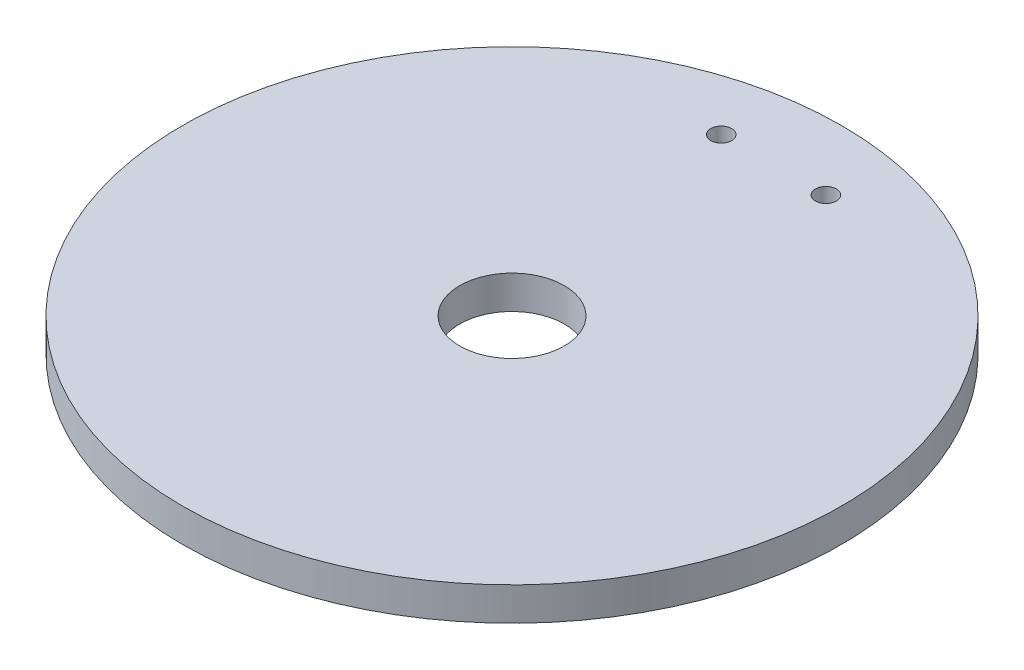
ISO-10303-21;
HEADER;
FILE_DESCRIPTION(('STEP AP214'),'2;1');
FILE_NAME('part.step','',(''),(''),'','','');
FILE_SCHEMA(('AUTOMOTIVE_DESIGN { 1 0 10303 214 1 1 1 1 }'));
ENDSEC;
DATA;
#1=APPLICATION_CONTEXT('core data for automotive mechanical design processes');
#2=APPLICATION_PROTOCOL_DEFINITION('international standard','automotive_design',2000,#1);
#3=PRODUCT_CONTEXT('',#1,'mechanical');
#4=PRODUCT('Part','Part','',(#3));
#5=PRODUCT_RELATED_PRODUCT_CATEGORY('part','',(#4));
#6=PRODUCT_DEFINITION_FORMATION('','',#4);
#7=PRODUCT_DEFINITION_CONTEXT('part definition',#1,'design');
#8=PRODUCT_DEFINITION('design','',#6,#7);
#9=PRODUCT_DEFINITION_SHAPE('','',#8);
#10=(LENGTH_UNIT() NAMED_UNIT(*) SI_UNIT(.MILLI.,.METRE.));
#11=(NAMED_UNIT(*) PLANE_ANGLE_UNIT() SI_UNIT($,.RADIAN.));
#12=(NAMED_UNIT(*) SI_UNIT($,.STERADIAN.) SOLID_ANGLE_UNIT());
#13=UNCERTAINTY_MEASURE_WITH_UNIT(LENGTH_MEASURE(1.E-05),#10,'distance_accuracy_value','');
#14=(GEOMETRIC_REPRESENTATION_CONTEXT(3) GLOBAL_UNCERTAINTY_ASSIGNED_CONTEXT((#13)) GLOBAL_UNIT_ASSIGNED_CONTEXT((#10,
#11,#12)) REPRESENTATION_CONTEXT('',''));
#15=CARTESIAN_POINT('',(0.,0.,0.));
#16=DIRECTION('',(0.,0.,1.));
#17=DIRECTION('',(1.,0.,0.));
#18=AXIS2_PLACEMENT_3D('',#15,#16,#17);
#19=CARTESIAN_POINT('',(0.,3.18,0.));
#20=DIRECTION('',(0.,1.,0.));
#21=DIRECTION('',(0.,0.,1.));
#22=AXIS2_PLACEMENT_3D('',#19,#20,#21);
#23=PLANE('',#22);
#24=CARTESIAN_POINT('',(-5.,3.18,-25.));
#25=DIRECTION('',(0.,1.,0.));
#26=DIRECTION('',(0.,0.,1.));
#27=AXIS2_PLACEMENT_3D('',#24,#25,#26);
#28=CIRCLE('',#27,1.);
#29=CARTESIAN_POINT('',(-5.,3.18,-24.));
#30=VERTEX_POINT('',#29);
#31=EDGE_CURVE('E69',#30,#30,#28,.T.);
#32=ORIENTED_EDGE('',*,*,#31,.F.);
#33=EDGE_LOOP('',(#32));
#34=FACE_BOUND('',#33,.T.);
#35=CARTESIAN_POINT('',(5.,3.18,-25.));
#36=DIRECTION('',(0.,1.,0.));
#37=DIRECTION('',(0.,0.,1.));
#38=AXIS2_PLACEMENT_3D('',#35,#36,#37);
#39=CIRCLE('',#38,1.);
#40=CARTESIAN_POINT('',(5.,3.18,-24.));
#41=VERTEX_POINT('',#40);
#42=EDGE_CURVE('E61',#41,#41,#39,.T.);
#43=ORIENTED_EDGE('',*,*,#42,.F.);
#44=EDGE_LOOP('',(#43));
#45=FACE_BOUND('',#44,.T.);
#46=CARTESIAN_POINT('',(0.,3.18,0.));
#47=DIRECTION('',(0.,1.,0.));
#48=DIRECTION('',(0.,0.,1.));
#49=AXIS2_PLACEMENT_3D('',#46,#47,#48);
#50=CIRCLE('',#49,31.5);
#51=CARTESIAN_POINT('',(0.,3.18,-31.5));
#52=VERTEX_POINT('',#51);
#53=EDGE_CURVE('E10',#52,#52,#50,.T.);
#54=ORIENTED_EDGE('',*,*,#53,.T.);
#55=EDGE_LOOP('',(#54));
#56=FACE_BOUND('',#55,.T.);
#57=CARTESIAN_POINT('',(0.,3.18,0.));
#58=DIRECTION('',(0.,1.,0.));
#59=DIRECTION('',(0.,0.,1.));
#60=AXIS2_PLACEMENT_3D('',#57,#58,#59);
#61=CIRCLE('',#60,5.);
#62=CARTESIAN_POINT('',(0.,3.18,-5.));
#63=VERTEX_POINT('',#62);
#64=EDGE_CURVE('E51',#63,#63,#61,.T.);
#65=ORIENTED_EDGE('',*,*,#64,.F.);
#66=EDGE_LOOP('',(#65));
#67=FACE_BOUND('',#66,.T.);
#68=ADVANCED_FACE('F38',(#34,#45,#56,#67),#23,.T.);
#69=CARTESIAN_POINT('',(0.,0.,0.));
#70=DIRECTION('',(0.,1.,0.));
#71=DIRECTION('',(0.,0.,1.));
#72=AXIS2_PLACEMENT_3D('',#69,#70,#71);
#73=PLANE('',#72);
#74=CARTESIAN_POINT('',(-5.,0.,-25.));
#75=DIRECTION('',(0.,1.,0.));
#76=DIRECTION('',(0.,0.,1.));
#77=AXIS2_PLACEMENT_3D('',#74,#75,#76);
#78=CIRCLE('',#77,1.);
#79=CARTESIAN_POINT('',(-5.,0.,-24.));
#80=VERTEX_POINT('',#79);
#81=EDGE_CURVE('E57',#80,#80,#78,.T.);
#82=ORIENTED_EDGE('',*,*,#81,.T.);
#83=EDGE_LOOP('',(#82));
#84=FACE_BOUND('',#83,.T.);
#85=CARTESIAN_POINT('',(5.,0.,-25.));
#86=DIRECTION('',(0.,1.,0.));
#87=DIRECTION('',(0.,0.,1.));
#88=AXIS2_PLACEMENT_3D('',#85,#86,#87);
#89=CIRCLE('',#88,1.);
#90=CARTESIAN_POINT('',(5.,0.,-24.));
#91=VERTEX_POINT('',#90);
#92=EDGE_CURVE('E65',#91,#91,#89,.T.);
#93=ORIENTED_EDGE('',*,*,#92,.T.);
#94=EDGE_LOOP('',(#93));
#95=FACE_BOUND('',#94,.T.);
#96=CARTESIAN_POINT('',(0.,0.,0.));
#97=DIRECTION('',(0.,1.,0.));
#98=DIRECTION('',(0.,0.,1.));
#99=AXIS2_PLACEMENT_3D('',#96,#97,#98);
#100=CIRCLE('',#99,31.5);
#101=CARTESIAN_POINT('',(0.,0.,-31.5));
#102=VERTEX_POINT('',#101);
#103=EDGE_CURVE('E42',#102,#102,#100,.T.);
#104=ORIENTED_EDGE('',*,*,#103,.F.);
#105=EDGE_LOOP('',(#104));
#106=FACE_BOUND('',#105,.T.);
#107=CARTESIAN_POINT('',(0.,0.,0.));
#108=DIRECTION('',(0.,1.,0.));
#109=DIRECTION('',(0.,0.,1.));
#110=AXIS2_PLACEMENT_3D('',#107,#108,#109);
#111=CIRCLE('',#110,5.);
#112=CARTESIAN_POINT('',(0.,0.,-5.));
#113=VERTEX_POINT('',#112);
#114=EDGE_CURVE('E53',#113,#113,#111,.T.);
#115=ORIENTED_EDGE('',*,*,#114,.T.);
#116=EDGE_LOOP('',(#115));
#117=FACE_BOUND('',#116,.T.);
#118=ADVANCED_FACE('F77',(#84,#95,#106,#117),#73,.F.);
#119=CARTESIAN_POINT('',(0.,3.18,0.));
#120=DIRECTION('',(0.,-1.,0.));
#121=DIRECTION('',(0.,0.,-1.));
#122=AXIS2_PLACEMENT_3D('',#119,#120,#121);
#123=CYLINDRICAL_SURFACE('',#122,31.5);
#124=CARTESIAN_POINT('',(0.,3.18,-31.5));
#125=CARTESIAN_POINT('',(0.,3.146875,-31.5));
#126=CARTESIAN_POINT('',(0.,3.11375,-31.5));
#127=CARTESIAN_POINT('',(0.,3.0475,-31.5));
#128=CARTESIAN_POINT('',(0.,3.014375,-31.5));
#129=CARTESIAN_POINT('',(0.,2.948125,-31.5));
#130=CARTESIAN_POINT('',(0.,2.915,-31.5));
#131=CARTESIAN_POINT('',(0.,2.84875,-31.5));
#132=CARTESIAN_POINT('',(0.,2.815625,-31.5));
#133=CARTESIAN_POINT('',(0.,2.749375,-31.5));
#134=CARTESIAN_POINT('',(0.,2.71625,-31.5));
#135=CARTESIAN_POINT('',(0.,2.65,-31.5));
#136=CARTESIAN_POINT('',(0.,2.616875,-31.5));
#137=CARTESIAN_POINT('',(0.,2.550625,-31.5));
#138=CARTESIAN_POINT('',(0.,2.5175,-31.5));
#139=CARTESIAN_POINT('',(0.,2.45125,-31.5));
#140=CARTESIAN_POINT('',(0.,2.418125,-31.5));
#141=CARTESIAN_POINT('',(0.,2.351875,-31.5));
#142=CARTESIAN_POINT('',(0.,2.31875,-31.5));
#143=CARTESIAN_POINT('',(0.,2.2525,-31.5));
#144=CARTESIAN_POINT('',(0.,2.219375,-31.5));
#145=CARTESIAN_POINT('',(0.,2.153125,-31.5));
#146=CARTESIAN_POINT('',(0.,2.12,-31.5));
#147=CARTESIAN_POINT('',(0.,2.05375,-31.5));
#148=CARTESIAN_POINT('',(0.,2.020625,-31.5));
#149=CARTESIAN_POINT('',(0.,1.954375,-31.5));
#150=CARTESIAN_POINT('',(0.,1.92125,-31.5));
#151=CARTESIAN_POINT('',(0.,1.855,-31.5));
#152=CARTESIAN_POINT('',(0.,1.821875,-31.5));
#153=CARTESIAN_POINT('',(0.,1.755625,-31.5));
#154=CARTESIAN_POINT('',(0.,1.7225,-31.5));
#155=CARTESIAN_POINT('',(0.,1.65625,-31.5));
#156=CARTESIAN_POINT('',(0.,1.623125,-31.5));
#157=CARTESIAN_POINT('',(0.,1.556875,-31.5));
#158=CARTESIAN_POINT('',(0.,1.52375,-31.5));
#159=CARTESIAN_POINT('',(0.,1.4575,-31.5));
#160=CARTESIAN_POINT('',(0.,1.424375,-31.5));
#161=CARTESIAN_POINT('',(0.,1.358125,-31.5));
#162=CARTESIAN_POINT('',(0.,1.325,-31.5));
#163=CARTESIAN_POINT('',(0.,1.25875,-31.5));
#164=CARTESIAN_POINT('',(0.,1.225625,-31.5));
#165=CARTESIAN_POINT('',(0.,1.159375,-31.5));
#166=CARTESIAN_POINT('',(0.,1.12625,-31.5));
#167=CARTESIAN_POINT('',(0.,1.06,-31.5));
#168=CARTESIAN_POINT('',(0.,1.026875,-31.5));
#169=CARTESIAN_POINT('',(0.,0.960625,-31.5));
#170=CARTESIAN_POINT('',(0.,0.9275,-31.5));
#171=CARTESIAN_POINT('',(0.,0.86125,-31.5));
#172=CARTESIAN_POINT('',(0.,0.828125,-31.5));
#173=CARTESIAN_POINT('',(0.,0.761875,-31.5));
#174=CARTESIAN_POINT('',(0.,0.72875,-31.5));
#175=CARTESIAN_POINT('',(0.,0.6625,-31.5));
#176=CARTESIAN_POINT('',(0.,0.629375,-31.5));
#177=CARTESIAN_POINT('',(0.,0.563125,-31.5));
#178=CARTESIAN_POINT('',(0.,0.53,-31.5));
#179=CARTESIAN_POINT('',(0.,0.46375,-31.5));
#180=CARTESIAN_POINT('',(0.,0.430625,-31.5));
#181=CARTESIAN_POINT('',(0.,0.364375,-31.5));
#182=CARTESIAN_POINT('',(0.,0.33125,-31.5));
#183=CARTESIAN_POINT('',(0.,0.265,-31.5));
#184=CARTESIAN_POINT('',(0.,0.231875,-31.5));
#185=CARTESIAN_POINT('',(0.,0.165625,-31.5));
#186=CARTESIAN_POINT('',(0.,0.1325,-31.5));
#187=CARTESIAN_POINT('',(0.,0.06625,-31.5));
#188=CARTESIAN_POINT('',(0.,0.033125,-31.5));
#189=CARTESIAN_POINT('',(0.,0.,-31.5));
#190=B_SPLINE_CURVE_WITH_KNOTS('',3,(#124,#125,#126,#127,#128,#129,#130,#131,#132,#133,#134,
#135,#136,#137,#138,#139,#140,#141,#142,#143,#144,#145,#146,#147,#148,#149,#150,#151,#152,#153,
#154,#155,#156,#157,#158,#159,#160,#161,#162,#163,#164,#165,#166,#167,#168,#169,#170,#171,#172,
#173,#174,#175,#176,#177,#178,#179,#180,#181,#182,#183,#184,#185,#186,#187,#188,#189),
.UNSPECIFIED.,.F.,.F.,(4,2,2,2,2,2,2,2,2,2,2,2,2,2,2,2,2,2,2,2,2,2,2,2,2,2,2,2,2,2,2,2,4),(0.,
0.0993750000000001,0.19875,0.298125,0.3975,0.496875,0.59625,0.695625,0.795,0.894375,0.99375,
1.093125,1.1925,1.291875,1.39125,1.490625,1.59,1.689375,1.78875,1.888125,1.9875,2.086875,
2.18625,2.285625,2.385,2.484375,2.58375,2.683125,2.7825,2.881875,2.98125,3.080625,3.18),.UNSPECIFIED.);
#191=EDGE_CURVE('BSEAM40',#52,#102,#190,.T.);
#192=ORIENTED_EDGE('',*,*,#53,.F.);
#193=ORIENTED_EDGE('',*,*,#103,.T.);
#194=ORIENTED_EDGE('',*,*,#191,.T.);
#195=ORIENTED_EDGE('',*,*,#191,.F.);
#196=EDGE_LOOP('',(#192,#194,#193,#195));
#197=FACE_BOUND('',#196,.T.);
#198=ADVANCED_FACE('F40',(#197),#123,.T.);
#199=CARTESIAN_POINT('',(0.,3.18,0.));
#200=DIRECTION('',(0.,-1.,0.));
#201=DIRECTION('',(0.,0.,-1.));
#202=AXIS2_PLACEMENT_3D('',#199,#200,#201);
#203=CYLINDRICAL_SURFACE('',#202,5.);
#204=CARTESIAN_POINT('',(0.,3.18,-5.));
#205=CARTESIAN_POINT('',(0.,3.146875,-5.));
#206=CARTESIAN_POINT('',(0.,3.11375,-5.));
#207=CARTESIAN_POINT('',(0.,3.0475,-5.));
#208=CARTESIAN_POINT('',(0.,3.014375,-5.));
#209=CARTESIAN_POINT('',(0.,2.948125,-5.));
#210=CARTESIAN_POINT('',(0.,2.915,-5.));
#211=CARTESIAN_POINT('',(0.,2.84875,-5.));
#212=CARTESIAN_POINT('',(0.,2.815625,-5.));
#213=CARTESIAN_POINT('',(0.,2.749375,-5.));
#214=CARTESIAN_POINT('',(0.,2.71625,-5.));
#215=CARTESIAN_POINT('',(0.,2.65,-5.));
#216=CARTESIAN_POINT('',(0.,2.616875,-5.));
#217=CARTESIAN_POINT('',(0.,2.550625,-5.));
#218=CARTESIAN_POINT('',(0.,2.5175,-5.));
#219=CARTESIAN_POINT('',(0.,2.45125,-5.));
#220=CARTESIAN_POINT('',(0.,2.418125,-5.));
#221=CARTESIAN_POINT('',(0.,2.351875,-5.));
#222=CARTESIAN_POINT('',(0.,2.31875,-5.));
#223=CARTESIAN_POINT('',(0.,2.2525,-5.));
#224=CARTESIAN_POINT('',(0.,2.219375,-5.));
#225=CARTESIAN_POINT('',(0.,2.153125,-5.));
#226=CARTESIAN_POINT('',(0.,2.12,-5.));
#227=CARTESIAN_POINT('',(0.,2.05375,-5.));
#228=CARTESIAN_POINT('',(0.,2.020625,-5.));
#229=CARTESIAN_POINT('',(0.,1.954375,-5.));
#230=CARTESIAN_POINT('',(0.,1.92125,-5.));
#231=CARTESIAN_POINT('',(0.,1.855,-5.));
#232=CARTESIAN_POINT('',(0.,1.821875,-5.));
#233=CARTESIAN_POINT('',(0.,1.755625,-5.));
#234=CARTESIAN_POINT('',(0.,1.7225,-5.));
#235=CARTESIAN_POINT('',(0.,1.65625,-5.));
#236=CARTESIAN_POINT('',(0.,1.623125,-5.));
#237=CARTESIAN_POINT('',(0.,1.556875,-5.));
#238=CARTESIAN_POINT('',(0.,1.52375,-5.));
#239=CARTESIAN_POINT('',(0.,1.4575,-5.));
#240=CARTESIAN_POINT('',(0.,1.424375,-5.));
#241=CARTESIAN_POINT('',(0.,1.358125,-5.));
#242=CARTESIAN_POINT('',(0.,1.325,-5.));
#243=CARTESIAN_POINT('',(0.,1.25875,-5.));
#244=CARTESIAN_POINT('',(0.,1.225625,-5.));
#245=CARTESIAN_POINT('',(0.,1.159375,-5.));
#246=CARTESIAN_POINT('',(0.,1.12625,-5.));
#247=CARTESIAN_POINT('',(0.,1.06,-5.));
#248=CARTESIAN_POINT('',(0.,1.026875,-5.));
#249=CARTESIAN_POINT('',(0.,0.960625,-5.));
#250=CARTESIAN_POINT('',(0.,0.9275,-5.));
#251=CARTESIAN_POINT('',(0.,0.86125,-5.));
#252=CARTESIAN_POINT('',(0.,0.828125,-5.));
#253=CARTESIAN_POINT('',(0.,0.761875,-5.));
#254=CARTESIAN_POINT('',(0.,0.72875,-5.));
#255=CARTESIAN_POINT('',(0.,0.6625,-5.));
#256=CARTESIAN_POINT('',(0.,0.629375,-5.));
#257=CARTESIAN_POINT('',(0.,0.563125,-5.));
#258=CARTESIAN_POINT('',(0.,0.53,-5.));
#259=CARTESIAN_POINT('',(0.,0.46375,-5.));
#260=CARTESIAN_POINT('',(0.,0.430625,-5.));
#261=CARTESIAN_POINT('',(0.,0.364375,-5.));
#262=CARTESIAN_POINT('',(0.,0.33125,-5.));
#263=CARTESIAN_POINT('',(0.,0.265,-5.));
#264=CARTESIAN_POINT('',(0.,0.231875,-5.));
#265=CARTESIAN_POINT('',(0.,0.165625,-5.));
#266=CARTESIAN_POINT('',(0.,0.1325,-5.));
#267=CARTESIAN_POINT('',(0.,0.06625,-5.));
#268=CARTESIAN_POINT('',(0.,0.033125,-5.));
#269=CARTESIAN_POINT('',(0.,0.,-5.));
#270=B_SPLINE_CURVE_WITH_KNOTS('',3,(#204,#205,#206,#207,#208,#209,#210,#211,#212,#213,#214,
#215,#216,#217,#218,#219,#220,#221,#222,#223,#224,#225,#226,#227,#228,#229,#230,#231,#232,#233,
#234,#235,#236,#237,#238,#239,#240,#241,#242,#243,#244,#245,#246,#247,#248,#249,#250,#251,#252,
#253,#254,#255,#256,#257,#258,#259,#260,#261,#262,#263,#264,#265,#266,#267,#268,#269),
.UNSPECIFIED.,.F.,.F.,(4,2,2,2,2,2,2,2,2,2,2,2,2,2,2,2,2,2,2,2,2,2,2,2,2,2,2,2,2,2,2,2,4),(0.,
0.0993750000000001,0.19875,0.298125,0.3975,0.496875,0.59625,0.695625,0.795,0.894375,0.99375,
1.093125,1.1925,1.291875,1.39125,1.490625,1.59,1.689375,1.78875,1.888125,1.9875,2.086875,
2.18625,2.285625,2.385,2.484375,2.58375,2.683125,2.7825,2.881875,2.98125,3.080625,3.18),.UNSPECIFIED.);
#271=EDGE_CURVE('BSEAM94',#63,#113,#270,.T.);
#272=ORIENTED_EDGE('',*,*,#64,.T.);
#273=ORIENTED_EDGE('',*,*,#114,.F.);
#274=ORIENTED_EDGE('',*,*,#271,.T.);
#275=ORIENTED_EDGE('',*,*,#271,.F.);
#276=EDGE_LOOP('',(#272,#274,#273,#275));
#277=FACE_BOUND('',#276,.T.);
#278=ADVANCED_FACE('F94',(#277),#203,.F.);
#279=CARTESIAN_POINT('',(5.,0.,-25.));
#280=DIRECTION('',(0.,1.,0.));
#281=DIRECTION('',(0.,0.,1.));
#282=AXIS2_PLACEMENT_3D('',#279,#280,#281);
#283=CYLINDRICAL_SURFACE('',#282,1.);
#284=CARTESIAN_POINT('',(5.,0.,-24.));
#285=CARTESIAN_POINT('',(5.,0.033125,-24.));
#286=CARTESIAN_POINT('',(5.,0.06625,-24.));
#287=CARTESIAN_POINT('',(5.,0.1325,-24.));
#288=CARTESIAN_POINT('',(5.,0.165625,-24.));
#289=CARTESIAN_POINT('',(5.,0.231875,-24.));
#290=CARTESIAN_POINT('',(5.,0.265,-24.));
#291=CARTESIAN_POINT('',(5.,0.33125,-24.));
#292=CARTESIAN_POINT('',(5.,0.364375,-24.));
#293=CARTESIAN_POINT('',(5.,0.430625,-24.));
#294=CARTESIAN_POINT('',(5.,0.46375,-24.));
#295=CARTESIAN_POINT('',(5.,0.53,-24.));
#296=CARTESIAN_POINT('',(5.,0.563125,-24.));
#297=CARTESIAN_POINT('',(5.,0.629375,-24.));
#298=CARTESIAN_POINT('',(5.,0.6625,-24.));
#299=CARTESIAN_POINT('',(5.,0.72875,-24.));
#300=CARTESIAN_POINT('',(5.,0.761875,-24.));
#301=CARTESIAN_POINT('',(5.,0.828125,-24.));
#302=CARTESIAN_POINT('',(5.,0.86125,-24.));
#303=CARTESIAN_POINT('',(5.,0.9275,-24.));
#304=CARTESIAN_POINT('',(5.,0.960625,-24.));
#305=CARTESIAN_POINT('',(5.,1.026875,-24.));
#306=CARTESIAN_POINT('',(5.,1.06,-24.));
#307=CARTESIAN_POINT('',(5.,1.12625,-24.));
#308=CARTESIAN_POINT('',(5.,1.159375,-24.));
#309=CARTESIAN_POINT('',(5.,1.225625,-24.));
#310=CARTESIAN_POINT('',(5.,1.25875,-24.));
#311=CARTESIAN_POINT('',(5.,1.325,-24.));
#312=CARTESIAN_POINT('',(5.,1.358125,-24.));
#313=CARTESIAN_POINT('',(5.,1.424375,-24.));
#314=CARTESIAN_POINT('',(5.,1.4575,-24.));
#315=CARTESIAN_POINT('',(5.,1.52375,-24.));
#316=CARTESIAN_POINT('',(5.,1.556875,-24.));
#317=CARTESIAN_POINT('',(5.,1.623125,-24.));
#318=CARTESIAN_POINT('',(5.,1.65625,-24.));
#319=CARTESIAN_POINT('',(5.,1.7225,-24.));
#320=CARTESIAN_POINT('',(5.,1.755625,-24.));
#321=CARTESIAN_POINT('',(5.,1.821875,-24.));
#322=CARTESIAN_POINT('',(5.,1.855,-24.));
#323=CARTESIAN_POINT('',(5.,1.92125,-24.));
#324=CARTESIAN_POINT('',(5.,1.954375,-24.));
#325=CARTESIAN_POINT('',(5.,2.020625,-24.));
#326=CARTESIAN_POINT('',(5.,2.05375,-24.));
#327=CARTESIAN_POINT('',(5.,2.12,-24.));
#328=CARTESIAN_POINT('',(5.,2.153125,-24.));
#329=CARTESIAN_POINT('',(5.,2.219375,-24.));
#330=CARTESIAN_POINT('',(5.,2.2525,-24.));
#331=CARTESIAN_POINT('',(5.,2.31875,-24.));
#332=CARTESIAN_POINT('',(5.,2.351875,-24.));
#333=CARTESIAN_POINT('',(5.,2.418125,-24.));
#334=CARTESIAN_POINT('',(5.,2.45125,-24.));
#335=CARTESIAN_POINT('',(5.,2.5175,-24.));
#336=CARTESIAN_POINT('',(5.,2.550625,-24.));
#337=CARTESIAN_POINT('',(5.,2.616875,-24.));
#338=CARTESIAN_POINT('',(5.,2.65,-24.));
#339=CARTESIAN_POINT('',(5.,2.71625,-24.));
#340=CARTESIAN_POINT('',(5.,2.749375,-24.));
#341=CARTESIAN_POINT('',(5.,2.815625,-24.));
#342=CARTESIAN_POINT('',(5.,2.84875,-24.));
#343=CARTESIAN_POINT('',(5.,2.915,-24.));
#344=CARTESIAN_POINT('',(5.,2.948125,-24.));
#345=CARTESIAN_POINT('',(5.,3.014375,-24.));
#346=CARTESIAN_POINT('',(5.,3.0475,-24.));
#347=CARTESIAN_POINT('',(5.,3.11375,-24.));
#348=CARTESIAN_POINT('',(5.,3.146875,-24.));
#349=CARTESIAN_POINT('',(5.,3.18,-24.));
#350=B_SPLINE_CURVE_WITH_KNOTS('',3,(#284,#285,#286,#287,#288,#289,#290,#291,#292,#293,#294,
#295,#296,#297,#298,#299,#300,#301,#302,#303,#304,#305,#306,#307,#308,#309,#310,#311,#312,#313,
#314,#315,#316,#317,#318,#319,#320,#321,#322,#323,#324,#325,#326,#327,#328,#329,#330,#331,#332,
#333,#334,#335,#336,#337,#338,#339,#340,#341,#342,#343,#344,#345,#346,#347,#348,#349),
.UNSPECIFIED.,.F.,.F.,(4,2,2,2,2,2,2,2,2,2,2,2,2,2,2,2,2,2,2,2,2,2,2,2,2,2,2,2,2,2,2,2,4),(0.,
0.099375,0.19875,0.298125,0.3975,0.496875,0.59625,0.695625,0.795,0.894375,0.99375,1.093125,
1.1925,1.291875,1.39125,1.490625,1.59,1.689375,1.78875,1.888125,1.9875,2.086875,2.18625,
2.285625,2.385,2.484375,2.58375,2.683125,2.7825,2.881875,2.98125,3.080625,3.18),.UNSPECIFIED.);
#351=EDGE_CURVE('BSEAM83',#91,#41,#350,.T.);
#352=ORIENTED_EDGE('',*,*,#92,.F.);
#353=ORIENTED_EDGE('',*,*,#42,.T.);
#354=ORIENTED_EDGE('',*,*,#351,.T.);
#355=ORIENTED_EDGE('',*,*,#351,.F.);
#356=EDGE_LOOP('',(#352,#354,#353,#355));
#357=FACE_BOUND('',#356,.T.);
#358=ADVANCED_FACE('F83',(#357),#283,.F.);
#359=CARTESIAN_POINT('',(-5.,0.,-25.));
#360=DIRECTION('',(0.,1.,0.));
#361=DIRECTION('',(0.,0.,1.));
#362=AXIS2_PLACEMENT_3D('',#359,#360,#361);
#363=CYLINDRICAL_SURFACE('',#362,1.);
#364=CARTESIAN_POINT('',(-5.,0.,-24.));
#365=CARTESIAN_POINT('',(-5.,0.033125,-24.));
#366=CARTESIAN_POINT('',(-5.,0.06625,-24.));
#367=CARTESIAN_POINT('',(-5.,0.1325,-24.));
#368=CARTESIAN_POINT('',(-5.,0.165625,-24.));
#369=CARTESIAN_POINT('',(-5.,0.231875,-24.));
#370=CARTESIAN_POINT('',(-5.,0.265,-24.));
#371=CARTESIAN_POINT('',(-5.,0.33125,-24.));
#372=CARTESIAN_POINT('',(-5.,0.364375,-24.));
#373=CARTESIAN_POINT('',(-5.,0.430625,-24.));
#374=CARTESIAN_POINT('',(-5.,0.46375,-24.));
#375=CARTESIAN_POINT('',(-5.,0.53,-24.));
#376=CARTESIAN_POINT('',(-5.,0.563125,-24.));
#377=CARTESIAN_POINT('',(-5.,0.629375,-24.));
#378=CARTESIAN_POINT('',(-5.,0.6625,-24.));
#379=CARTESIAN_POINT('',(-5.,0.72875,-24.));
#380=CARTESIAN_POINT('',(-5.,0.761875,-24.));
#381=CARTESIAN_POINT('',(-5.,0.828125,-24.));
#382=CARTESIAN_POINT('',(-5.,0.86125,-24.));
#383=CARTESIAN_POINT('',(-5.,0.9275,-24.));
#384=CARTESIAN_POINT('',(-5.,0.960625,-24.));
#385=CARTESIAN_POINT('',(-5.,1.026875,-24.));
#386=CARTESIAN_POINT('',(-5.,1.06,-24.));
#387=CARTESIAN_POINT('',(-5.,1.12625,-24.));
#388=CARTESIAN_POINT('',(-5.,1.159375,-24.));
#389=CARTESIAN_POINT('',(-5.,1.225625,-24.));
#390=CARTESIAN_POINT('',(-5.,1.25875,-24.));
#391=CARTESIAN_POINT('',(-5.,1.325,-24.));
#392=CARTESIAN_POINT('',(-5.,1.358125,-24.));
#393=CARTESIAN_POINT('',(-5.,1.424375,-24.));
#394=CARTESIAN_POINT('',(-5.,1.4575,-24.));
#395=CARTESIAN_POINT('',(-5.,1.52375,-24.));
#396=CARTESIAN_POINT('',(-5.,1.556875,-24.));
#397=CARTESIAN_POINT('',(-5.,1.623125,-24.));
#398=CARTESIAN_POINT('',(-5.,1.65625,-24.));
#399=CARTESIAN_POINT('',(-5.,1.7225,-24.));
#400=CARTESIAN_POINT('',(-5.,1.755625,-24.));
#401=CARTESIAN_POINT('',(-5.,1.821875,-24.));
#402=CARTESIAN_POINT('',(-5.,1.855,-24.));
#403=CARTESIAN_POINT('',(-5.,1.92125,-24.));
#404=CARTESIAN_POINT('',(-5.,1.954375,-24.));
#405=CARTESIAN_POINT('',(-5.,2.020625,-24.));
#406=CARTESIAN_POINT('',(-5.,2.05375,-24.));
#407=CARTESIAN_POINT('',(-5.,2.12,-24.));
#408=CARTESIAN_POINT('',(-5.,2.153125,-24.));
#409=CARTESIAN_POINT('',(-5.,2.219375,-24.));
#410=CARTESIAN_POINT('',(-5.,2.2525,-24.));
#411=CARTESIAN_POINT('',(-5.,2.31875,-24.));
#412=CARTESIAN_POINT('',(-5.,2.351875,-24.));
#413=CARTESIAN_POINT('',(-5.,2.418125,-24.));
#414=CARTESIAN_POINT('',(-5.,2.45125,-24.));
#415=CARTESIAN_POINT('',(-5.,2.5175,-24.));
#416=CARTESIAN_POINT('',(-5.,2.550625,-24.));
#417=CARTESIAN_POINT('',(-5.,2.616875,-24.));
#418=CARTESIAN_POINT('',(-5.,2.65,-24.));
#419=CARTESIAN_POINT('',(-5.,2.71625,-24.));
#420=CARTESIAN_POINT('',(-5.,2.749375,-24.));
#421=CARTESIAN_POINT('',(-5.,2.815625,-24.));
#422=CARTESIAN_POINT('',(-5.,2.84875,-24.));
#423=CARTESIAN_POINT('',(-5.,2.915,-24.));
#424=CARTESIAN_POINT('',(-5.,2.948125,-24.));
#425=CARTESIAN_POINT('',(-5.,3.014375,-24.));
#426=CARTESIAN_POINT('',(-5.,3.0475,-24.));
#427=CARTESIAN_POINT('',(-5.,3.11375,-24.));
#428=CARTESIAN_POINT('',(-5.,3.146875,-24.));
#429=CARTESIAN_POINT('',(-5.,3.18,-24.));
#430=B_SPLINE_CURVE_WITH_KNOTS('',3,(#364,#365,#366,#367,#368,#369,#370,#371,#372,#373,#374,
#375,#376,#377,#378,#379,#380,#381,#382,#383,#384,#385,#386,#387,#388,#389,#390,#391,#392,#393,
#394,#395,#396,#397,#398,#399,#400,#401,#402,#403,#404,#405,#406,#407,#408,#409,#410,#411,#412,
#413,#414,#415,#416,#417,#418,#419,#420,#421,#422,#423,#424,#425,#426,#427,#428,#429),
.UNSPECIFIED.,.F.,.F.,(4,2,2,2,2,2,2,2,2,2,2,2,2,2,2,2,2,2,2,2,2,2,2,2,2,2,2,2,2,2,2,2,4),(0.,
0.099375,0.19875,0.298125,0.3975,0.496875,0.59625,0.695625,0.795,0.894375,0.99375,1.093125,
1.1925,1.291875,1.39125,1.490625,1.59,1.689375,1.78875,1.888125,1.9875,2.086875,2.18625,
2.285625,2.385,2.484375,2.58375,2.683125,2.7825,2.881875,2.98125,3.080625,3.18),.UNSPECIFIED.);
#431=EDGE_CURVE('BSEAM80',#80,#30,#430,.T.);
#432=ORIENTED_EDGE('',*,*,#81,.F.);
#433=ORIENTED_EDGE('',*,*,#31,.T.);
#434=ORIENTED_EDGE('',*,*,#431,.T.);
#435=ORIENTED_EDGE('',*,*,#431,.F.);
#436=EDGE_LOOP('',(#432,#434,#433,#435));
#437=FACE_BOUND('',#436,.T.);
#438=ADVANCED_FACE('F80',(#437),#363,.F.);
#439=CLOSED_SHELL('',(#68,#118,#198,#278,#358,#438));
#440=MANIFOLD_SOLID_BREP('B2',#439);
#441=ADVANCED_BREP_SHAPE_REPRESENTATION('',(#18,#440),#14);
#442=SHAPE_DEFINITION_REPRESENTATION(#9,#441);
ENDSEC;
END-ISO-10303-21;
